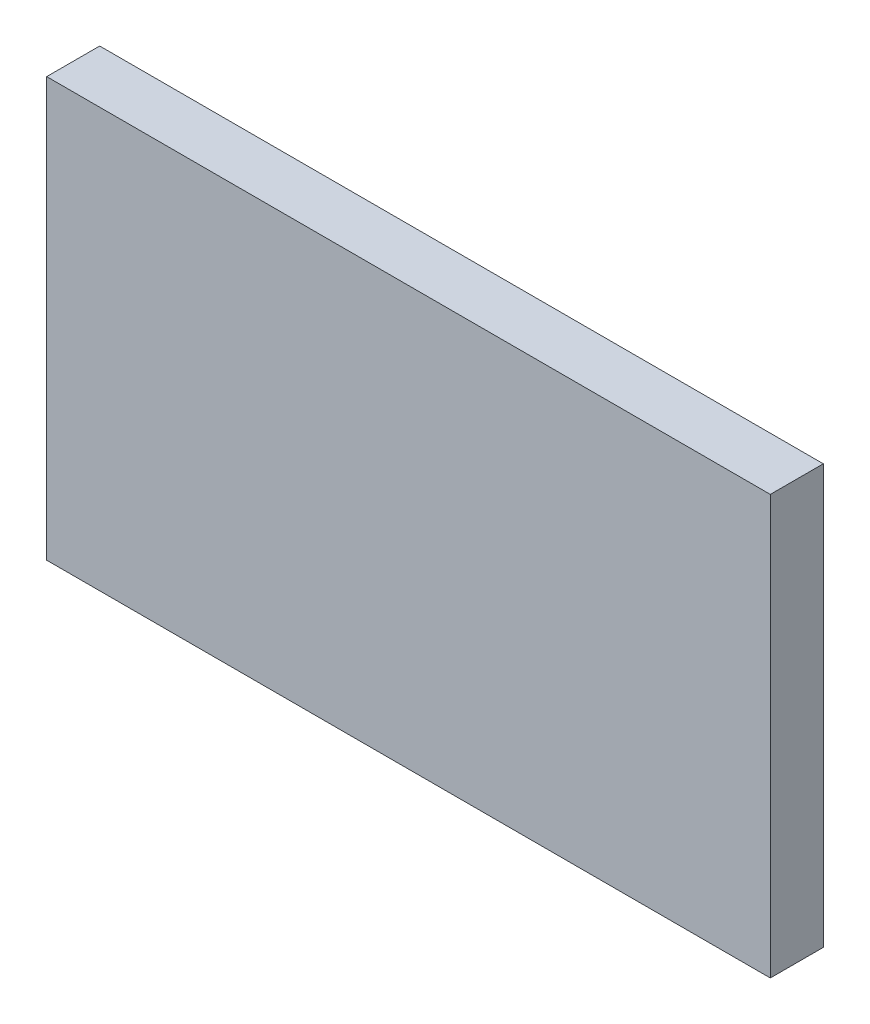
ISO-10303-21;
HEADER;
FILE_DESCRIPTION(('STEP AP214'),'2;1');
FILE_NAME('part.step','',(''),(''),'','','');
FILE_SCHEMA(('AUTOMOTIVE_DESIGN { 1 0 10303 214 1 1 1 1 }'));
ENDSEC;
DATA;
#1=APPLICATION_CONTEXT('core data for automotive mechanical design processes');
#2=APPLICATION_PROTOCOL_DEFINITION('international standard','automotive_design',2000,#1);
#3=PRODUCT_CONTEXT('',#1,'mechanical');
#4=PRODUCT('Part','Part','',(#3));
#5=PRODUCT_RELATED_PRODUCT_CATEGORY('part','',(#4));
#6=PRODUCT_DEFINITION_FORMATION('','',#4);
#7=PRODUCT_DEFINITION_CONTEXT('part definition',#1,'design');
#8=PRODUCT_DEFINITION('design','',#6,#7);
#9=PRODUCT_DEFINITION_SHAPE('','',#8);
#10=(LENGTH_UNIT() NAMED_UNIT(*) SI_UNIT(.MILLI.,.METRE.));
#11=(NAMED_UNIT(*) PLANE_ANGLE_UNIT() SI_UNIT($,.RADIAN.));
#12=(NAMED_UNIT(*) SI_UNIT($,.STERADIAN.) SOLID_ANGLE_UNIT());
#13=UNCERTAINTY_MEASURE_WITH_UNIT(LENGTH_MEASURE(1.E-05),#10,'distance_accuracy_value','');
#14=(GEOMETRIC_REPRESENTATION_CONTEXT(3) GLOBAL_UNCERTAINTY_ASSIGNED_CONTEXT((#13)) GLOBAL_UNIT_ASSIGNED_CONTEXT((#10,
#11,#12)) REPRESENTATION_CONTEXT('',''));
#15=CARTESIAN_POINT('',(0.,0.,0.));
#16=DIRECTION('',(0.,0.,1.));
#17=DIRECTION('',(1.,0.,0.));
#18=AXIS2_PLACEMENT_3D('',#15,#16,#17);
#19=CARTESIAN_POINT('',(-228.854,-132.461,33.528));
#20=DIRECTION('',(1.,0.,0.));
#21=DIRECTION('',(0.,0.,-1.));
#22=AXIS2_PLACEMENT_3D('',#19,#20,#21);
#23=PLANE('',#22);
#24=DIRECTION('',(0.,-1.,0.));
#25=VECTOR('',#24,1.);
#26=CARTESIAN_POINT('',(-228.854,-132.461,0.));
#27=LINE('',#26,#25);
#28=CARTESIAN_POINT('',(-228.854,132.461,0.));
#29=VERTEX_POINT('',#28);
#30=CARTESIAN_POINT('',(-228.854,-132.461,0.));
#31=VERTEX_POINT('',#30);
#32=EDGE_CURVE('E95',#29,#31,#27,.T.);
#33=ORIENTED_EDGE('',*,*,#32,.T.);
#34=DIRECTION('',(0.,0.,-1.));
#35=VECTOR('',#34,1.);
#36=CARTESIAN_POINT('',(-228.854,-132.461,33.528));
#37=LINE('',#36,#35);
#38=CARTESIAN_POINT('',(-228.854,-132.461,33.528));
#39=VERTEX_POINT('',#38);
#40=EDGE_CURVE('E11',#39,#31,#37,.T.);
#41=ORIENTED_EDGE('',*,*,#40,.F.);
#42=DIRECTION('',(0.,-1.,0.));
#43=VECTOR('',#42,1.);
#44=CARTESIAN_POINT('',(-228.854,-132.461,33.528));
#45=LINE('',#44,#43);
#46=CARTESIAN_POINT('',(-228.854,132.461,33.528));
#47=VERTEX_POINT('',#46);
#48=EDGE_CURVE('E83',#47,#39,#45,.T.);
#49=ORIENTED_EDGE('',*,*,#48,.F.);
#50=DIRECTION('',(0.,0.,-1.));
#51=VECTOR('',#50,1.);
#52=CARTESIAN_POINT('',(-228.854,132.461,33.528));
#53=LINE('',#52,#51);
#54=EDGE_CURVE('E91',#47,#29,#53,.T.);
#55=ORIENTED_EDGE('',*,*,#54,.T.);
#56=EDGE_LOOP('',(#33,#41,#49,#55));
#57=FACE_BOUND('',#56,.T.);
#58=ADVANCED_FACE('F32',(#57),#23,.F.);
#59=CARTESIAN_POINT('',(-228.854,-132.461,33.528));
#60=DIRECTION('',(0.,1.,0.));
#61=DIRECTION('',(0.,0.,1.));
#62=AXIS2_PLACEMENT_3D('',#59,#60,#61);
#63=PLANE('',#62);
#64=DIRECTION('',(1.,0.,0.));
#65=VECTOR('',#64,1.);
#66=CARTESIAN_POINT('',(-228.854,-132.461,0.));
#67=LINE('',#66,#65);
#68=CARTESIAN_POINT('',(228.854,-132.461,0.));
#69=VERTEX_POINT('',#68);
#70=EDGE_CURVE('E87',#31,#69,#67,.T.);
#71=ORIENTED_EDGE('',*,*,#70,.T.);
#72=DIRECTION('',(0.,0.,-1.));
#73=VECTOR('',#72,1.);
#74=CARTESIAN_POINT('',(228.854,-132.461,33.528));
#75=LINE('',#74,#73);
#76=CARTESIAN_POINT('',(228.854,-132.461,33.528));
#77=VERTEX_POINT('',#76);
#78=EDGE_CURVE('E40',#77,#69,#75,.T.);
#79=ORIENTED_EDGE('',*,*,#78,.F.);
#80=DIRECTION('',(1.,0.,0.));
#81=VECTOR('',#80,1.);
#82=CARTESIAN_POINT('',(-228.854,-132.461,33.528));
#83=LINE('',#82,#81);
#84=EDGE_CURVE('E78',#39,#77,#83,.T.);
#85=ORIENTED_EDGE('',*,*,#84,.F.);
#86=ORIENTED_EDGE('',*,*,#40,.T.);
#87=EDGE_LOOP('',(#71,#79,#85,#86));
#88=FACE_BOUND('',#87,.T.);
#89=ADVANCED_FACE('F86',(#88),#63,.F.);
#90=CARTESIAN_POINT('',(228.854,-132.461,33.528));
#91=DIRECTION('',(-1.,0.,0.));
#92=DIRECTION('',(0.,-1.,0.));
#93=AXIS2_PLACEMENT_3D('',#90,#91,#92);
#94=PLANE('',#93);
#95=DIRECTION('',(0.,1.,0.));
#96=VECTOR('',#95,1.);
#97=CARTESIAN_POINT('',(228.854,-132.461,0.));
#98=LINE('',#97,#96);
#99=CARTESIAN_POINT('',(228.854,132.461,0.));
#100=VERTEX_POINT('',#99);
#101=EDGE_CURVE('E65',#69,#100,#98,.T.);
#102=ORIENTED_EDGE('',*,*,#101,.T.);
#103=DIRECTION('',(0.,0.,-1.));
#104=VECTOR('',#103,1.);
#105=CARTESIAN_POINT('',(228.854,132.461,33.528));
#106=LINE('',#105,#104);
#107=CARTESIAN_POINT('',(228.854,132.461,33.528));
#108=VERTEX_POINT('',#107);
#109=EDGE_CURVE('E88',#108,#100,#106,.T.);
#110=ORIENTED_EDGE('',*,*,#109,.F.);
#111=DIRECTION('',(0.,1.,0.));
#112=VECTOR('',#111,1.);
#113=CARTESIAN_POINT('',(228.854,-132.461,33.528));
#114=LINE('',#113,#112);
#115=EDGE_CURVE('E81',#77,#108,#114,.T.);
#116=ORIENTED_EDGE('',*,*,#115,.F.);
#117=ORIENTED_EDGE('',*,*,#78,.T.);
#118=EDGE_LOOP('',(#102,#110,#116,#117));
#119=FACE_BOUND('',#118,.T.);
#120=ADVANCED_FACE('F89',(#119),#94,.F.);
#121=CARTESIAN_POINT('',(-228.854,132.461,33.528));
#122=DIRECTION('',(0.,-1.,0.));
#123=DIRECTION('',(0.,0.,-1.));
#124=AXIS2_PLACEMENT_3D('',#121,#122,#123);
#125=PLANE('',#124);
#126=DIRECTION('',(-1.,0.,0.));
#127=VECTOR('',#126,1.);
#128=CARTESIAN_POINT('',(-228.854,132.461,0.));
#129=LINE('',#128,#127);
#130=EDGE_CURVE('E71',#100,#29,#129,.T.);
#131=ORIENTED_EDGE('',*,*,#130,.T.);
#132=ORIENTED_EDGE('',*,*,#54,.F.);
#133=DIRECTION('',(-1.,0.,0.));
#134=VECTOR('',#133,1.);
#135=CARTESIAN_POINT('',(-228.854,132.461,33.528));
#136=LINE('',#135,#134);
#137=EDGE_CURVE('E48',#108,#47,#136,.T.);
#138=ORIENTED_EDGE('',*,*,#137,.F.);
#139=ORIENTED_EDGE('',*,*,#109,.T.);
#140=EDGE_LOOP('',(#131,#132,#138,#139));
#141=FACE_BOUND('',#140,.T.);
#142=ADVANCED_FACE('F102',(#141),#125,.F.);
#143=CARTESIAN_POINT('',(0.,0.,33.528));
#144=DIRECTION('',(0.,0.,-1.));
#145=DIRECTION('',(-1.,0.,0.));
#146=AXIS2_PLACEMENT_3D('',#143,#144,#145);
#147=PLANE('',#146);
#148=ORIENTED_EDGE('',*,*,#48,.T.);
#149=ORIENTED_EDGE('',*,*,#84,.T.);
#150=ORIENTED_EDGE('',*,*,#115,.T.);
#151=ORIENTED_EDGE('',*,*,#137,.T.);
#152=EDGE_LOOP('',(#148,#149,#150,#151));
#153=FACE_BOUND('',#152,.T.);
#154=ADVANCED_FACE('F79',(#153),#147,.F.);
#155=CARTESIAN_POINT('',(0.,0.,0.));
#156=DIRECTION('',(0.,0.,-1.));
#157=DIRECTION('',(-1.,0.,0.));
#158=AXIS2_PLACEMENT_3D('',#155,#156,#157);
#159=PLANE('',#158);
#160=ORIENTED_EDGE('',*,*,#32,.F.);
#161=ORIENTED_EDGE('',*,*,#130,.F.);
#162=ORIENTED_EDGE('',*,*,#101,.F.);
#163=ORIENTED_EDGE('',*,*,#70,.F.);
#164=EDGE_LOOP('',(#160,#161,#162,#163));
#165=FACE_BOUND('',#164,.T.);
#166=ADVANCED_FACE('F105',(#165),#159,.T.);
#167=CLOSED_SHELL('',(#58,#89,#120,#142,#154,#166));
#168=MANIFOLD_SOLID_BREP('B2',#167);
#169=ADVANCED_BREP_SHAPE_REPRESENTATION('',(#18,#168),#14);
#170=SHAPE_DEFINITION_REPRESENTATION(#9,#169);
ENDSEC;
END-ISO-10303-21;
